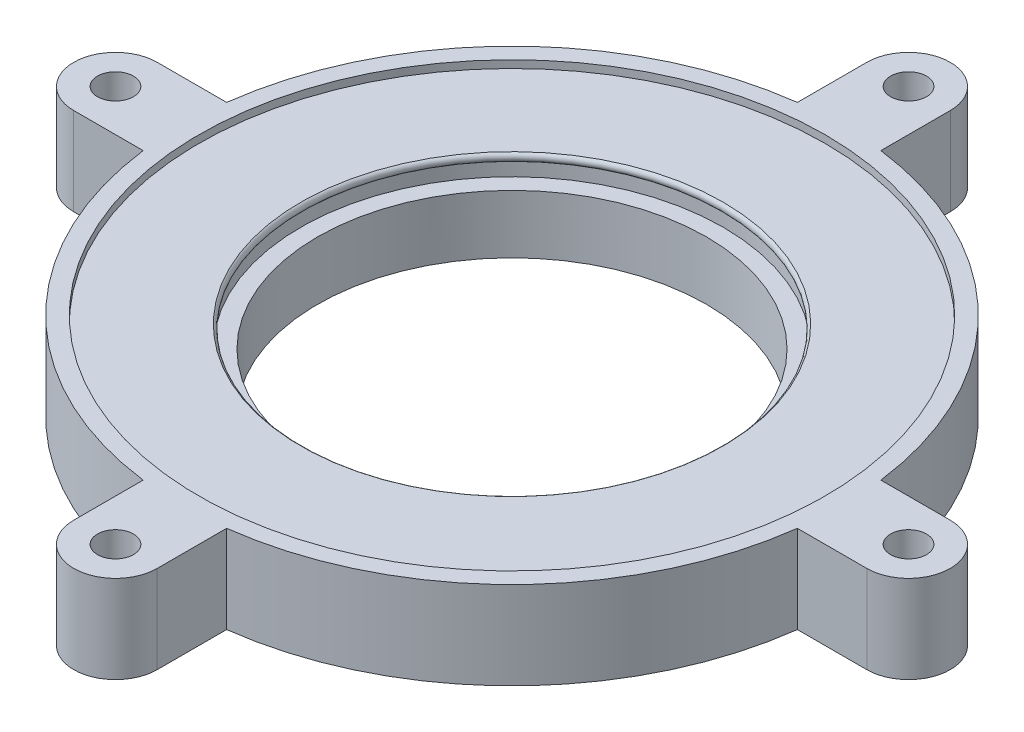
ISO-10303-21;
HEADER;
FILE_DESCRIPTION(('STEP AP214'),'2;1');
FILE_NAME('part.step','',(''),(''),'','','');
FILE_SCHEMA(('AUTOMOTIVE_DESIGN { 1 0 10303 214 1 1 1 1 }'));
ENDSEC;
DATA;
#1=APPLICATION_CONTEXT('core data for automotive mechanical design processes');
#2=APPLICATION_PROTOCOL_DEFINITION('international standard','automotive_design',2000,#1);
#3=PRODUCT_CONTEXT('',#1,'mechanical');
#4=PRODUCT('Part','Part','',(#3));
#5=PRODUCT_RELATED_PRODUCT_CATEGORY('part','',(#4));
#6=PRODUCT_DEFINITION_FORMATION('','',#4);
#7=PRODUCT_DEFINITION_CONTEXT('part definition',#1,'design');
#8=PRODUCT_DEFINITION('design','',#6,#7);
#9=PRODUCT_DEFINITION_SHAPE('','',#8);
#10=(LENGTH_UNIT() NAMED_UNIT(*) SI_UNIT(.MILLI.,.METRE.));
#11=(NAMED_UNIT(*) PLANE_ANGLE_UNIT() SI_UNIT($,.RADIAN.));
#12=(NAMED_UNIT(*) SI_UNIT($,.STERADIAN.) SOLID_ANGLE_UNIT());
#13=UNCERTAINTY_MEASURE_WITH_UNIT(LENGTH_MEASURE(1.E-05),#10,'distance_accuracy_value','');
#14=(GEOMETRIC_REPRESENTATION_CONTEXT(3) GLOBAL_UNCERTAINTY_ASSIGNED_CONTEXT((#13)) GLOBAL_UNIT_ASSIGNED_CONTEXT((#10,
#11,#12)) REPRESENTATION_CONTEXT('',''));
#15=CARTESIAN_POINT('',(0.,0.,0.));
#16=DIRECTION('',(0.,0.,1.));
#17=DIRECTION('',(1.,0.,0.));
#18=AXIS2_PLACEMENT_3D('',#15,#16,#17);
#19=CARTESIAN_POINT('',(0.,-1000.,-3.43024899888577E-12));
#20=DIRECTION('',(0.,-1.,0.));
#21=DIRECTION('',(0.,0.,-1.));
#22=AXIS2_PLACEMENT_3D('',#19,#20,#21);
#23=CYLINDRICAL_SURFACE('',#22,39.5);
#24=DIRECTION('',(0.,-1.,0.));
#25=VECTOR('',#24,1.);
#26=CARTESIAN_POINT('',(-39.1822663969283,15.605960434235,4.99999999999756));
#27=LINE('',#26,#25);
#28=CARTESIAN_POINT('',(-39.1822663969283,-1.04822907838721,5.00000000001453));
#29=VERTEX_POINT('',#28);
#30=CARTESIAN_POINT('',(-39.1822663969283,-11.5554427268863,5.00000000001478));
#31=VERTEX_POINT('',#30);
#32=EDGE_CURVE('E170',#29,#31,#27,.T.);
#33=ORIENTED_EDGE('',*,*,#32,.T.);
#34=CARTESIAN_POINT('',(0.,-11.5554427268862,0.));
#35=DIRECTION('',(0.,-1.,0.));
#36=DIRECTION('',(0.,0.,-1.));
#37=AXIS2_PLACEMENT_3D('',#34,#35,#36);
#38=CIRCLE('',#37,39.5);
#39=CARTESIAN_POINT('',(-4.99999999999997,-11.5554427268864,39.1822663969301));
#40=VERTEX_POINT('',#39);
#41=EDGE_CURVE('E316',#40,#31,#38,.T.);
#42=ORIENTED_EDGE('',*,*,#41,.F.);
#43=DIRECTION('',(0.,-1.,0.));
#44=VECTOR('',#43,1.);
#45=CARTESIAN_POINT('',(-4.99999999999997,15.6059604342349,39.1822663969302));
#46=LINE('',#45,#44);
#47=CARTESIAN_POINT('',(-4.99999999999997,-1.04822907838735,39.1822663969302));
#48=VERTEX_POINT('',#47);
#49=EDGE_CURVE('E289',#48,#40,#46,.T.);
#50=ORIENTED_EDGE('',*,*,#49,.F.);
#51=CARTESIAN_POINT('',(0.,-1.0482290783872,0.));
#52=DIRECTION('',(0.,-1.,0.));
#53=DIRECTION('',(0.,0.,-1.));
#54=AXIS2_PLACEMENT_3D('',#51,#52,#53);
#55=CIRCLE('',#54,39.5);
#56=EDGE_CURVE('E62',#48,#29,#55,.T.);
#57=ORIENTED_EDGE('',*,*,#56,.T.);
#58=EDGE_LOOP('',(#33,#42,#50,#57));
#59=FACE_BOUND('',#58,.T.);
#60=ADVANCED_FACE('F47',(#59),#23,.T.);
#61=DIRECTION('',(0.,-1.,0.));
#62=VECTOR('',#61,1.);
#63=CARTESIAN_POINT('',(-39.1822663969283,15.605960434235,-5.00000000000244));
#64=LINE('',#63,#62);
#65=CARTESIAN_POINT('',(-39.1822663969283,-1.04822907838719,-5.0000000000025));
#66=VERTEX_POINT('',#65);
#67=CARTESIAN_POINT('',(-39.1822663969298,-11.5554427268862,-5.00000000000253));
#68=VERTEX_POINT('',#67);
#69=EDGE_CURVE('E171',#66,#68,#64,.T.);
#70=ORIENTED_EDGE('',*,*,#69,.F.);
#71=CARTESIAN_POINT('',(-4.99999999999506,-1.04822907838706,-39.1822663969308));
#72=VERTEX_POINT('',#71);
#73=EDGE_CURVE('E167',#66,#72,#55,.T.);
#74=ORIENTED_EDGE('',*,*,#73,.T.);
#75=DIRECTION('',(0.,-1.,0.));
#76=VECTOR('',#75,1.);
#77=CARTESIAN_POINT('',(-4.99999999999562,15.6059604342351,-39.1822663969307));
#78=LINE('',#77,#76);
#79=CARTESIAN_POINT('',(-4.99999999999534,-11.5554427268861,-39.1822663969308));
#80=VERTEX_POINT('',#79);
#81=EDGE_CURVE('E218',#72,#80,#78,.T.);
#82=ORIENTED_EDGE('',*,*,#81,.T.);
#83=EDGE_CURVE('E70',#68,#80,#38,.T.);
#84=ORIENTED_EDGE('',*,*,#83,.F.);
#85=EDGE_LOOP('',(#70,#74,#82,#84));
#86=FACE_BOUND('',#85,.T.);
#87=ADVANCED_FACE('F340',(#86),#23,.T.);
#88=DIRECTION('',(0.,-1.,0.));
#89=VECTOR('',#88,1.);
#90=CARTESIAN_POINT('',(5.00000000000438,15.6059604342351,-39.1822663969307));
#91=LINE('',#90,#89);
#92=CARTESIAN_POINT('',(5.00000000000438,-1.04822907838706,-39.1822663969308));
#93=VERTEX_POINT('',#92);
#94=CARTESIAN_POINT('',(5.00000000000438,-11.5554427268861,-39.1822663969296));
#95=VERTEX_POINT('',#94);
#96=EDGE_CURVE('E213',#93,#95,#91,.T.);
#97=ORIENTED_EDGE('',*,*,#96,.F.);
#98=CARTESIAN_POINT('',(39.1822663969304,-1.04822907838718,-4.99999999999811));
#99=VERTEX_POINT('',#98);
#100=EDGE_CURVE('E364',#93,#99,#55,.T.);
#101=ORIENTED_EDGE('',*,*,#100,.T.);
#102=DIRECTION('',(0.,-1.,0.));
#103=VECTOR('',#102,1.);
#104=CARTESIAN_POINT('',(39.1822663969326,15.605960434235,-4.99999999999805));
#105=LINE('',#104,#103);
#106=CARTESIAN_POINT('',(39.1822663969326,-11.5554427268862,-4.9999999999806));
#107=VERTEX_POINT('',#106);
#108=EDGE_CURVE('E251',#99,#107,#105,.T.);
#109=ORIENTED_EDGE('',*,*,#108,.T.);
#110=EDGE_CURVE('E366',#95,#107,#38,.T.);
#111=ORIENTED_EDGE('',*,*,#110,.F.);
#112=EDGE_LOOP('',(#97,#101,#109,#111));
#113=FACE_BOUND('',#112,.T.);
#114=ADVANCED_FACE('F337',(#113),#23,.T.);
#115=CARTESIAN_POINT('',(0.,-2.4554427268862,0.));
#116=DIRECTION('',(0.,-1.,0.));
#117=DIRECTION('',(0.,0.,-1.));
#118=AXIS2_PLACEMENT_3D('',#115,#116,#117);
#119=TOROIDAL_SURFACE('',#118,25.5666666666667,0.566666666666666);
#120=CARTESIAN_POINT('',(0.,-2.95544272688619,0.));
#121=DIRECTION('',(0.,-1.,0.));
#122=DIRECTION('',(0.,0.,-1.));
#123=AXIS2_PLACEMENT_3D('',#120,#121,#122);
#124=CIRCLE('',#123,25.3);
#125=CARTESIAN_POINT('',(0.,-2.95544272688611,-25.3));
#126=VERTEX_POINT('',#125);
#127=EDGE_CURVE('E292',#126,#126,#124,.T.);
#128=ORIENTED_EDGE('',*,*,#127,.T.);
#129=EDGE_LOOP('',(#128));
#130=FACE_BOUND('',#129,.T.);
#131=CARTESIAN_POINT('',(0.,-1.95544272688619,0.));
#132=DIRECTION('',(0.,-1.,0.));
#133=DIRECTION('',(0.,0.,-1.));
#134=AXIS2_PLACEMENT_3D('',#131,#132,#133);
#135=CIRCLE('',#134,25.3);
#136=CARTESIAN_POINT('',(0.,-1.9554427268861,-25.3));
#137=VERTEX_POINT('',#136);
#138=EDGE_CURVE('E11',#137,#137,#135,.T.);
#139=ORIENTED_EDGE('',*,*,#138,.F.);
#140=EDGE_LOOP('',(#139));
#141=FACE_BOUND('',#140,.T.);
#142=ADVANCED_FACE('F49',(#130,#141),#119,.T.);
#143=CARTESIAN_POINT('',(0.,-1.95544272688621,0.));
#144=DIRECTION('',(0.,1.,0.));
#145=DIRECTION('',(0.,0.,1.));
#146=AXIS2_PLACEMENT_3D('',#143,#144,#145);
#147=PLANE('',#146);
#148=ORIENTED_EDGE('',*,*,#138,.T.);
#149=EDGE_LOOP('',(#148));
#150=FACE_BOUND('',#149,.T.);
#151=CARTESIAN_POINT('',(0.,-1.95544272688619,0.));
#152=DIRECTION('',(0.,-1.,0.));
#153=DIRECTION('',(0.,0.,-1.));
#154=AXIS2_PLACEMENT_3D('',#151,#152,#153);
#155=CIRCLE('',#154,37.5);
#156=CARTESIAN_POINT('',(0.,-1.95544272688606,-37.5));
#157=VERTEX_POINT('',#156);
#158=EDGE_CURVE('E55',#157,#157,#155,.T.);
#159=ORIENTED_EDGE('',*,*,#158,.F.);
#160=EDGE_LOOP('',(#159));
#161=FACE_BOUND('',#160,.T.);
#162=ADVANCED_FACE('F329',(#150,#161),#147,.T.);
#163=CARTESIAN_POINT('',(0.,-1000.,-3.43024899888577E-12));
#164=DIRECTION('',(0.,-1.,0.));
#165=DIRECTION('',(0.,0.,-1.));
#166=AXIS2_PLACEMENT_3D('',#163,#164,#165);
#167=CYLINDRICAL_SURFACE('',#166,37.5);
#168=ORIENTED_EDGE('',*,*,#158,.T.);
#169=EDGE_LOOP('',(#168));
#170=FACE_BOUND('',#169,.T.);
#171=CARTESIAN_POINT('',(0.,-1.0482290783872,0.));
#172=DIRECTION('',(0.,-1.,0.));
#173=DIRECTION('',(0.,0.,-1.));
#174=AXIS2_PLACEMENT_3D('',#171,#172,#173);
#175=CIRCLE('',#174,37.5);
#176=CARTESIAN_POINT('',(0.,-1.04822907838707,-37.5));
#177=VERTEX_POINT('',#176);
#178=EDGE_CURVE('E321',#177,#177,#175,.T.);
#179=ORIENTED_EDGE('',*,*,#178,.F.);
#180=EDGE_LOOP('',(#179));
#181=FACE_BOUND('',#180,.T.);
#182=ADVANCED_FACE('F326',(#170,#181),#167,.F.);
#183=CARTESIAN_POINT('',(0.,-1.0482290783872,0.));
#184=DIRECTION('',(0.,1.,0.));
#185=DIRECTION('',(0.,0.,1.));
#186=AXIS2_PLACEMENT_3D('',#183,#184,#185);
#187=PLANE('',#186);
#188=ORIENTED_EDGE('',*,*,#73,.F.);
#189=DIRECTION('',(1.,0.,0.));
#190=VECTOR('',#189,1.);
#191=CARTESIAN_POINT('',(-47.4999999999981,-1.04822907838719,-5.0000000000025));
#192=LINE('',#191,#190);
#193=CARTESIAN_POINT('',(-47.4999999999981,-1.04822907838719,-5.0000000000025));
#194=VERTEX_POINT('',#193);
#195=EDGE_CURVE('E160',#194,#66,#192,.T.);
#196=ORIENTED_EDGE('',*,*,#195,.F.);
#197=CARTESIAN_POINT('',(-47.4999999999981,-1.04822907838721,-2.49818003626543E-12));
#198=DIRECTION('',(0.,1.,0.));
#199=DIRECTION('',(0.,0.,1.));
#200=AXIS2_PLACEMENT_3D('',#197,#198,#199);
#201=CIRCLE('',#200,5.);
#202=CARTESIAN_POINT('',(-47.4999999999981,-1.04822907838722,4.9999999999975));
#203=VERTEX_POINT('',#202);
#204=EDGE_CURVE('E164',#203,#194,#201,.F.);
#205=ORIENTED_EDGE('',*,*,#204,.F.);
#206=DIRECTION('',(-1.,0.,0.));
#207=VECTOR('',#206,1.);
#208=CARTESIAN_POINT('',(-47.4999999999981,-1.04822907838722,4.9999999999975));
#209=LINE('',#208,#207);
#210=EDGE_CURVE('E186',#29,#203,#209,.T.);
#211=ORIENTED_EDGE('',*,*,#210,.F.);
#212=ORIENTED_EDGE('',*,*,#56,.F.);
#213=DIRECTION('',(0.,0.,-1.));
#214=VECTOR('',#213,1.);
#215=CARTESIAN_POINT('',(-5.,-1.04822907838737,47.5));
#216=LINE('',#215,#214);
#217=CARTESIAN_POINT('',(-5.,-1.04822907838737,47.5));
#218=VERTEX_POINT('',#217);
#219=EDGE_CURVE('E293',#218,#48,#216,.T.);
#220=ORIENTED_EDGE('',*,*,#219,.F.);
#221=CARTESIAN_POINT('',(0.,-1.04822907838737,47.5));
#222=DIRECTION('',(0.,1.,0.));
#223=DIRECTION('',(0.,0.,1.));
#224=AXIS2_PLACEMENT_3D('',#221,#222,#223);
#225=CIRCLE('',#224,5.);
#226=CARTESIAN_POINT('',(5.,-1.04822907838737,47.5));
#227=VERTEX_POINT('',#226);
#228=EDGE_CURVE('E260',#227,#218,#225,.F.);
#229=ORIENTED_EDGE('',*,*,#228,.F.);
#230=DIRECTION('',(0.,0.,1.));
#231=VECTOR('',#230,1.);
#232=CARTESIAN_POINT('',(5.,-1.04822907838737,47.5));
#233=LINE('',#232,#231);
#234=CARTESIAN_POINT('',(4.99999999999992,-1.04822907838733,39.1822663969301));
#235=VERTEX_POINT('',#234);
#236=EDGE_CURVE('E300',#235,#227,#233,.T.);
#237=ORIENTED_EDGE('',*,*,#236,.F.);
#238=CARTESIAN_POINT('',(39.1822663969326,-1.04822907838722,5.00000000000189));
#239=VERTEX_POINT('',#238);
#240=EDGE_CURVE('E319',#239,#235,#55,.T.);
#241=ORIENTED_EDGE('',*,*,#240,.F.);
#242=DIRECTION('',(-1.,0.,0.));
#243=VECTOR('',#242,1.);
#244=CARTESIAN_POINT('',(47.5000000000025,-1.04822907838722,5.00000000000189));
#245=LINE('',#244,#243);
#246=CARTESIAN_POINT('',(47.5000000000025,-1.04822907838722,5.00000000000189));
#247=VERTEX_POINT('',#246);
#248=EDGE_CURVE('E249',#247,#239,#245,.T.);
#249=ORIENTED_EDGE('',*,*,#248,.F.);
#250=CARTESIAN_POINT('',(47.5000000000025,-1.04822907838721,1.88842671473998E-12));
#251=DIRECTION('',(0.,1.,0.));
#252=DIRECTION('',(0.,0.,1.));
#253=AXIS2_PLACEMENT_3D('',#250,#251,#252);
#254=CIRCLE('',#253,5.);
#255=CARTESIAN_POINT('',(47.5000000000025,-1.04822907838719,-4.99999999999811));
#256=VERTEX_POINT('',#255);
#257=EDGE_CURVE('E244',#256,#247,#254,.F.);
#258=ORIENTED_EDGE('',*,*,#257,.F.);
#259=DIRECTION('',(1.,0.,0.));
#260=VECTOR('',#259,1.);
#261=CARTESIAN_POINT('',(47.5000000000025,-1.04822907838719,-4.99999999999811));
#262=LINE('',#261,#260);
#263=EDGE_CURVE('E245',#99,#256,#262,.T.);
#264=ORIENTED_EDGE('',*,*,#263,.F.);
#265=ORIENTED_EDGE('',*,*,#100,.F.);
#266=DIRECTION('',(0.,0.,1.));
#267=VECTOR('',#266,1.);
#268=CARTESIAN_POINT('',(5.00000000000438,-1.04822907838704,-47.5000000000006));
#269=LINE('',#268,#267);
#270=CARTESIAN_POINT('',(5.00000000000438,-1.04822907838704,-47.5000000000006));
#271=VERTEX_POINT('',#270);
#272=EDGE_CURVE('E216',#271,#93,#269,.T.);
#273=ORIENTED_EDGE('',*,*,#272,.F.);
#274=CARTESIAN_POINT('',(4.38078967870946E-12,-1.04822907838704,-47.5000000000006));
#275=DIRECTION('',(0.,1.,0.));
#276=DIRECTION('',(0.,0.,1.));
#277=AXIS2_PLACEMENT_3D('',#274,#275,#276);
#278=CIRCLE('',#277,5.);
#279=CARTESIAN_POINT('',(-4.99999999999562,-1.04822907838704,-47.5000000000006));
#280=VERTEX_POINT('',#279);
#281=EDGE_CURVE('E211',#280,#271,#278,.F.);
#282=ORIENTED_EDGE('',*,*,#281,.F.);
#283=DIRECTION('',(0.,0.,-1.));
#284=VECTOR('',#283,1.);
#285=CARTESIAN_POINT('',(-4.99999999999562,-1.04822907838704,-47.5000000000006));
#286=LINE('',#285,#284);
#287=EDGE_CURVE('E212',#72,#280,#286,.T.);
#288=ORIENTED_EDGE('',*,*,#287,.F.);
#289=EDGE_LOOP('',(#188,#196,#205,#211,#212,#220,#229,#237,#241,#249,#258,#264,#265,#273,#282,#288));
#290=FACE_BOUND('',#289,.T.);
#291=ORIENTED_EDGE('',*,*,#178,.T.);
#292=EDGE_LOOP('',(#291));
#293=FACE_BOUND('',#292,.T.);
#294=CARTESIAN_POINT('',(0.,-1.04822907838737,47.5));
#295=DIRECTION('',(0.,1.,0.));
#296=DIRECTION('',(0.,0.,1.));
#297=AXIS2_PLACEMENT_3D('',#294,#295,#296);
#298=CIRCLE('',#297,2.15);
#299=CARTESIAN_POINT('',(0.,-1.04822907838738,49.65));
#300=VERTEX_POINT('',#299);
#301=EDGE_CURVE('E279',#300,#300,#298,.F.);
#302=ORIENTED_EDGE('',*,*,#301,.T.);
#303=EDGE_LOOP('',(#302));
#304=FACE_BOUND('',#303,.T.);
#305=CARTESIAN_POINT('',(47.5000000000025,-1.04822907838721,1.88842671473998E-12));
#306=DIRECTION('',(0.,1.,0.));
#307=DIRECTION('',(0.,0.,1.));
#308=AXIS2_PLACEMENT_3D('',#305,#306,#307);
#309=CIRCLE('',#308,2.15000000000181);
#310=CARTESIAN_POINT('',(47.5000000000025,-1.04822907838721,2.1500000000037));
#311=VERTEX_POINT('',#310);
#312=EDGE_CURVE('E226',#311,#311,#309,.F.);
#313=ORIENTED_EDGE('',*,*,#312,.T.);
#314=EDGE_LOOP('',(#313));
#315=FACE_BOUND('',#314,.T.);
#316=CARTESIAN_POINT('',(4.38078967870946E-12,-1.04822907838704,-47.5000000000006));
#317=DIRECTION('',(0.,1.,0.));
#318=DIRECTION('',(0.,0.,1.));
#319=AXIS2_PLACEMENT_3D('',#316,#317,#318);
#320=CIRCLE('',#319,2.15000000000548);
#321=CARTESIAN_POINT('',(4.38078967870946E-12,-1.04822907838705,-45.3499999999951));
#322=VERTEX_POINT('',#321);
#323=EDGE_CURVE('E180',#322,#322,#320,.F.);
#324=ORIENTED_EDGE('',*,*,#323,.T.);
#325=EDGE_LOOP('',(#324));
#326=FACE_BOUND('',#325,.T.);
#327=CARTESIAN_POINT('',(-47.4999999999981,-1.04822907838721,-2.49818003626543E-12));
#328=DIRECTION('',(0.,1.,0.));
#329=DIRECTION('',(0.,0.,1.));
#330=AXIS2_PLACEMENT_3D('',#327,#328,#329);
#331=CIRCLE('',#330,2.15000000000515);
#332=CARTESIAN_POINT('',(-47.4999999999981,-1.04822907838721,2.15000000000265));
#333=VERTEX_POINT('',#332);
#334=EDGE_CURVE('E197',#333,#333,#331,.F.);
#335=ORIENTED_EDGE('',*,*,#334,.T.);
#336=EDGE_LOOP('',(#335));
#337=FACE_BOUND('',#336,.T.);
#338=ADVANCED_FACE('F162',(#290,#293,#304,#315,#326,#337),#187,.T.);
#339=DIRECTION('',(0.,-1.,0.));
#340=VECTOR('',#339,1.);
#341=CARTESIAN_POINT('',(39.1822663969326,15.605960434235,5.00000000000194));
#342=LINE('',#341,#340);
#343=CARTESIAN_POINT('',(39.1822663969299,-11.5554427268863,5.00000000000185));
#344=VERTEX_POINT('',#343);
#345=EDGE_CURVE('E246',#239,#344,#342,.T.);
#346=ORIENTED_EDGE('',*,*,#345,.F.);
#347=ORIENTED_EDGE('',*,*,#240,.T.);
#348=DIRECTION('',(0.,-1.,0.));
#349=VECTOR('',#348,1.);
#350=CARTESIAN_POINT('',(5.00000000000003,15.6059604342349,39.1822663969302));
#351=LINE('',#350,#349);
#352=CARTESIAN_POINT('',(5.00000000000003,-11.5554427268864,39.1822663969301));
#353=VERTEX_POINT('',#352);
#354=EDGE_CURVE('E296',#235,#353,#351,.T.);
#355=ORIENTED_EDGE('',*,*,#354,.T.);
#356=EDGE_CURVE('E315',#344,#353,#38,.T.);
#357=ORIENTED_EDGE('',*,*,#356,.F.);
#358=EDGE_LOOP('',(#346,#347,#355,#357));
#359=FACE_BOUND('',#358,.T.);
#360=ADVANCED_FACE('F342',(#359),#23,.T.);
#361=CARTESIAN_POINT('',(0.,-11.5554427268862,0.));
#362=DIRECTION('',(0.,-1.,0.));
#363=DIRECTION('',(0.,0.,-1.));
#364=AXIS2_PLACEMENT_3D('',#361,#362,#363);
#365=PLANE('',#364);
#366=CARTESIAN_POINT('',(0.,-11.5554427268862,0.));
#367=DIRECTION('',(0.,-1.,0.));
#368=DIRECTION('',(0.,0.,-1.));
#369=AXIS2_PLACEMENT_3D('',#366,#367,#368);
#370=CIRCLE('',#369,23.3);
#371=CARTESIAN_POINT('',(0.,-11.5554427268862,-23.3000000000001));
#372=VERTEX_POINT('',#371);
#373=EDGE_CURVE('E430',#372,#372,#370,.T.);
#374=ORIENTED_EDGE('',*,*,#373,.F.);
#375=EDGE_LOOP('',(#374));
#376=FACE_BOUND('',#375,.T.);
#377=CARTESIAN_POINT('',(-30.,-11.5554427268862,0.));
#378=DIRECTION('',(0.,-1.,0.));
#379=DIRECTION('',(0.,0.,-1.));
#380=AXIS2_PLACEMENT_3D('',#377,#378,#379);
#381=CIRCLE('',#380,2.15);
#382=CARTESIAN_POINT('',(-30.,-11.5554427268862,-2.15000000000004));
#383=VERTEX_POINT('',#382);
#384=EDGE_CURVE('E439',#383,#383,#381,.T.);
#385=ORIENTED_EDGE('',*,*,#384,.F.);
#386=EDGE_LOOP('',(#385));
#387=FACE_BOUND('',#386,.T.);
#388=CARTESIAN_POINT('',(0.,-11.5554427268863,30.));
#389=DIRECTION('',(0.,-1.,0.));
#390=DIRECTION('',(0.,0.,-1.));
#391=AXIS2_PLACEMENT_3D('',#388,#389,#390);
#392=CIRCLE('',#391,2.15);
#393=CARTESIAN_POINT('',(0.,-11.5554427268863,27.85));
#394=VERTEX_POINT('',#393);
#395=EDGE_CURVE('E442',#394,#394,#392,.T.);
#396=ORIENTED_EDGE('',*,*,#395,.F.);
#397=EDGE_LOOP('',(#396));
#398=FACE_BOUND('',#397,.T.);
#399=CARTESIAN_POINT('',(30.,-11.5554427268862,0.));
#400=DIRECTION('',(0.,-1.,0.));
#401=DIRECTION('',(0.,0.,-1.));
#402=AXIS2_PLACEMENT_3D('',#399,#400,#401);
#403=CIRCLE('',#402,2.15);
#404=CARTESIAN_POINT('',(30.,-11.5554427268862,-2.15000000000003));
#405=VERTEX_POINT('',#404);
#406=EDGE_CURVE('E448',#405,#405,#403,.T.);
#407=ORIENTED_EDGE('',*,*,#406,.F.);
#408=EDGE_LOOP('',(#407));
#409=FACE_BOUND('',#408,.T.);
#410=CARTESIAN_POINT('',(0.,-11.5554427268861,-30.));
#411=DIRECTION('',(0.,-1.,0.));
#412=DIRECTION('',(0.,0.,-1.));
#413=AXIS2_PLACEMENT_3D('',#410,#411,#412);
#414=CIRCLE('',#413,2.15);
#415=CARTESIAN_POINT('',(0.,-11.5554427268861,-32.15));
#416=VERTEX_POINT('',#415);
#417=EDGE_CURVE('E433',#416,#416,#414,.T.);
#418=ORIENTED_EDGE('',*,*,#417,.F.);
#419=EDGE_LOOP('',(#418));
#420=FACE_BOUND('',#419,.T.);
#421=ORIENTED_EDGE('',*,*,#41,.T.);
#422=DIRECTION('',(-1.,0.,0.));
#423=VECTOR('',#422,1.);
#424=CARTESIAN_POINT('',(-47.4999999999981,-11.5554427268863,4.99999999999747));
#425=LINE('',#424,#423);
#426=CARTESIAN_POINT('',(-47.4999999999981,-11.5554427268863,4.99999999999747));
#427=VERTEX_POINT('',#426);
#428=EDGE_CURVE('E200',#31,#427,#425,.T.);
#429=ORIENTED_EDGE('',*,*,#428,.T.);
#430=CARTESIAN_POINT('',(-47.4999999999981,-11.5554427268862,-2.53422239536427E-12));
#431=DIRECTION('',(0.,-1.,0.));
#432=DIRECTION('',(0.,0.,-1.));
#433=AXIS2_PLACEMENT_3D('',#430,#431,#432);
#434=CIRCLE('',#433,5.);
#435=CARTESIAN_POINT('',(-47.4999999999981,-11.5554427268862,-5.00000000000253));
#436=VERTEX_POINT('',#435);
#437=EDGE_CURVE('E204',#427,#436,#434,.T.);
#438=ORIENTED_EDGE('',*,*,#437,.T.);
#439=DIRECTION('',(1.,0.,0.));
#440=VECTOR('',#439,1.);
#441=CARTESIAN_POINT('',(-47.4999999999981,-11.5554427268862,-5.00000000000253));
#442=LINE('',#441,#440);
#443=EDGE_CURVE('E184',#436,#68,#442,.T.);
#444=ORIENTED_EDGE('',*,*,#443,.T.);
#445=ORIENTED_EDGE('',*,*,#83,.T.);
#446=DIRECTION('',(0.,0.,-1.));
#447=VECTOR('',#446,1.);
#448=CARTESIAN_POINT('',(-4.99999999999562,-11.5554427268861,-47.5000000000006));
#449=LINE('',#448,#447);
#450=CARTESIAN_POINT('',(-4.99999999999562,-11.5554427268861,-47.5000000000006));
#451=VERTEX_POINT('',#450);
#452=EDGE_CURVE('E231',#80,#451,#449,.T.);
#453=ORIENTED_EDGE('',*,*,#452,.T.);
#454=CARTESIAN_POINT('',(4.38078967870946E-12,-11.5554427268861,-47.5000000000006));
#455=DIRECTION('',(0.,-1.,0.));
#456=DIRECTION('',(0.,0.,-1.));
#457=AXIS2_PLACEMENT_3D('',#454,#455,#456);
#458=CIRCLE('',#457,5.);
#459=CARTESIAN_POINT('',(5.00000000000438,-11.5554427268861,-47.5000000000006));
#460=VERTEX_POINT('',#459);
#461=EDGE_CURVE('E234',#451,#460,#458,.T.);
#462=ORIENTED_EDGE('',*,*,#461,.T.);
#463=DIRECTION('',(0.,0.,1.));
#464=VECTOR('',#463,1.);
#465=CARTESIAN_POINT('',(5.00000000000438,-11.5554427268861,-47.5000000000006));
#466=LINE('',#465,#464);
#467=EDGE_CURVE('E237',#460,#95,#466,.T.);
#468=ORIENTED_EDGE('',*,*,#467,.T.);
#469=ORIENTED_EDGE('',*,*,#110,.T.);
#470=DIRECTION('',(1.,0.,0.));
#471=VECTOR('',#470,1.);
#472=CARTESIAN_POINT('',(47.5000000000025,-11.5554427268862,-4.99999999999815));
#473=LINE('',#472,#471);
#474=CARTESIAN_POINT('',(47.5000000000025,-11.5554427268862,-4.99999999999815));
#475=VERTEX_POINT('',#474);
#476=EDGE_CURVE('E265',#107,#475,#473,.T.);
#477=ORIENTED_EDGE('',*,*,#476,.T.);
#478=CARTESIAN_POINT('',(47.5000000000025,-11.5554427268862,1.85238435564114E-12));
#479=DIRECTION('',(0.,-1.,0.));
#480=DIRECTION('',(0.,0.,-1.));
#481=AXIS2_PLACEMENT_3D('',#478,#479,#480);
#482=CIRCLE('',#481,5.);
#483=CARTESIAN_POINT('',(47.5000000000025,-11.5554427268863,5.00000000000185));
#484=VERTEX_POINT('',#483);
#485=EDGE_CURVE('E268',#475,#484,#482,.T.);
#486=ORIENTED_EDGE('',*,*,#485,.T.);
#487=DIRECTION('',(-1.,0.,0.));
#488=VECTOR('',#487,1.);
#489=CARTESIAN_POINT('',(47.5000000000025,-11.5554427268863,5.00000000000185));
#490=LINE('',#489,#488);
#491=EDGE_CURVE('E271',#484,#344,#490,.T.);
#492=ORIENTED_EDGE('',*,*,#491,.T.);
#493=ORIENTED_EDGE('',*,*,#356,.T.);
#494=DIRECTION('',(0.,0.,1.));
#495=VECTOR('',#494,1.);
#496=CARTESIAN_POINT('',(5.,-11.5554427268864,47.5));
#497=LINE('',#496,#495);
#498=CARTESIAN_POINT('',(5.,-11.5554427268864,47.5));
#499=VERTEX_POINT('',#498);
#500=EDGE_CURVE('E276',#353,#499,#497,.T.);
#501=ORIENTED_EDGE('',*,*,#500,.T.);
#502=CARTESIAN_POINT('',(0.,-11.5554427268864,47.5));
#503=DIRECTION('',(0.,-1.,0.));
#504=DIRECTION('',(0.,0.,-1.));
#505=AXIS2_PLACEMENT_3D('',#502,#503,#504);
#506=CIRCLE('',#505,5.);
#507=CARTESIAN_POINT('',(-5.,-11.5554427268864,47.5));
#508=VERTEX_POINT('',#507);
#509=EDGE_CURVE('E283',#499,#508,#506,.T.);
#510=ORIENTED_EDGE('',*,*,#509,.T.);
#511=DIRECTION('',(0.,0.,-1.));
#512=VECTOR('',#511,1.);
#513=CARTESIAN_POINT('',(-5.,-11.5554427268864,47.5));
#514=LINE('',#513,#512);
#515=EDGE_CURVE('E280',#508,#40,#514,.T.);
#516=ORIENTED_EDGE('',*,*,#515,.T.);
#517=EDGE_LOOP('',(#421,#429,#438,#444,#445,#453,#462,#468,#469,#477,#486,#492,#493,#501,#510,#516));
#518=FACE_BOUND('',#517,.T.);
#519=CARTESIAN_POINT('',(0.,-11.5554427268864,47.5));
#520=DIRECTION('',(0.,-1.,0.));
#521=DIRECTION('',(0.,0.,-1.));
#522=AXIS2_PLACEMENT_3D('',#519,#520,#521);
#523=CIRCLE('',#522,2.15);
#524=CARTESIAN_POINT('',(0.,-11.5554427268864,45.35));
#525=VERTEX_POINT('',#524);
#526=EDGE_CURVE('E286',#525,#525,#523,.T.);
#527=ORIENTED_EDGE('',*,*,#526,.F.);
#528=EDGE_LOOP('',(#527));
#529=FACE_BOUND('',#528,.T.);
#530=CARTESIAN_POINT('',(47.5000000000025,-11.5554427268862,1.85238435564113E-12));
#531=DIRECTION('',(0.,-1.,0.));
#532=DIRECTION('',(0.,0.,-1.));
#533=AXIS2_PLACEMENT_3D('',#530,#531,#532);
#534=CIRCLE('',#533,2.15000000000181);
#535=CARTESIAN_POINT('',(47.5000000000025,-11.5554427268862,-2.14999999999996));
#536=VERTEX_POINT('',#535);
#537=EDGE_CURVE('E250',#536,#536,#534,.T.);
#538=ORIENTED_EDGE('',*,*,#537,.F.);
#539=EDGE_LOOP('',(#538));
#540=FACE_BOUND('',#539,.T.);
#541=CARTESIAN_POINT('',(4.38078967870946E-12,-11.5554427268861,-47.5000000000006));
#542=DIRECTION('',(0.,-1.,0.));
#543=DIRECTION('',(0.,0.,-1.));
#544=AXIS2_PLACEMENT_3D('',#541,#542,#543);
#545=CIRCLE('',#544,2.15000000000548);
#546=CARTESIAN_POINT('',(4.38078967870946E-12,-11.5554427268861,-49.6500000000061));
#547=VERTEX_POINT('',#546);
#548=EDGE_CURVE('E217',#547,#547,#545,.T.);
#549=ORIENTED_EDGE('',*,*,#548,.F.);
#550=EDGE_LOOP('',(#549));
#551=FACE_BOUND('',#550,.T.);
#552=CARTESIAN_POINT('',(-47.4999999999981,-11.5554427268862,-2.53422239536427E-12));
#553=DIRECTION('',(0.,-1.,0.));
#554=DIRECTION('',(0.,0.,-1.));
#555=AXIS2_PLACEMENT_3D('',#552,#553,#554);
#556=CIRCLE('',#555,2.15000000000515);
#557=CARTESIAN_POINT('',(-47.4999999999981,-11.5554427268862,-2.15000000000768));
#558=VERTEX_POINT('',#557);
#559=EDGE_CURVE('E194',#558,#558,#556,.T.);
#560=ORIENTED_EDGE('',*,*,#559,.F.);
#561=EDGE_LOOP('',(#560));
#562=FACE_BOUND('',#561,.T.);
#563=ADVANCED_FACE('F349',(#376,#387,#398,#409,#420,#518,#529,#540,#551,#562),#365,.T.);
#564=CARTESIAN_POINT('',(0.,-4.55544272688626,0.));
#565=DIRECTION('',(0.,1.,0.));
#566=DIRECTION('',(0.,0.,1.));
#567=AXIS2_PLACEMENT_3D('',#564,#565,#566);
#568=PLANE('',#567);
#569=CARTESIAN_POINT('',(0.,-4.55544272688625,0.));
#570=DIRECTION('',(0.,1.,0.));
#571=DIRECTION('',(0.,0.,1.));
#572=AXIS2_PLACEMENT_3D('',#569,#570,#571);
#573=CIRCLE('',#572,23.3);
#574=CARTESIAN_POINT('',(0.,-4.55544272688633,23.3));
#575=VERTEX_POINT('',#574);
#576=EDGE_CURVE('E423',#575,#575,#573,.F.);
#577=ORIENTED_EDGE('',*,*,#576,.T.);
#578=EDGE_LOOP('',(#577));
#579=FACE_BOUND('',#578,.T.);
#580=CARTESIAN_POINT('',(0.,-4.55544272688624,0.));
#581=DIRECTION('',(0.,-1.,0.));
#582=DIRECTION('',(0.,0.,-1.));
#583=AXIS2_PLACEMENT_3D('',#580,#581,#582);
#584=CIRCLE('',#583,25.3);
#585=CARTESIAN_POINT('',(0.,-4.55544272688615,-25.3));
#586=VERTEX_POINT('',#585);
#587=EDGE_CURVE('E312',#586,#586,#584,.T.);
#588=ORIENTED_EDGE('',*,*,#587,.F.);
#589=EDGE_LOOP('',(#588));
#590=FACE_BOUND('',#589,.T.);
#591=ADVANCED_FACE('F356',(#579,#590),#568,.T.);
#592=CARTESIAN_POINT('',(0.,-1000.,-3.43024899888577E-12));
#593=DIRECTION('',(0.,-1.,0.));
#594=DIRECTION('',(0.,0.,-1.));
#595=AXIS2_PLACEMENT_3D('',#592,#593,#594);
#596=CYLINDRICAL_SURFACE('',#595,25.3);
#597=ORIENTED_EDGE('',*,*,#587,.T.);
#598=EDGE_LOOP('',(#597));
#599=FACE_BOUND('',#598,.T.);
#600=ORIENTED_EDGE('',*,*,#127,.F.);
#601=EDGE_LOOP('',(#600));
#602=FACE_BOUND('',#601,.T.);
#603=ADVANCED_FACE('F400',(#599,#602),#596,.F.);
#604=CARTESIAN_POINT('',(0.,15.6059604342349,47.5));
#605=DIRECTION('',(0.,-1.,0.));
#606=DIRECTION('',(0.,0.,-1.));
#607=AXIS2_PLACEMENT_3D('',#604,#605,#606);
#608=CYLINDRICAL_SURFACE('',#607,5.);
#609=DIRECTION('',(0.,-1.,0.));
#610=VECTOR('',#609,1.);
#611=CARTESIAN_POINT('',(5.,15.6059604342349,47.5));
#612=LINE('',#611,#610);
#613=EDGE_CURVE('E303',#227,#499,#612,.T.);
#614=ORIENTED_EDGE('',*,*,#613,.F.);
#615=ORIENTED_EDGE('',*,*,#228,.T.);
#616=DIRECTION('',(0.,-1.,0.));
#617=VECTOR('',#616,1.);
#618=CARTESIAN_POINT('',(-5.,15.6059604342349,47.5));
#619=LINE('',#618,#617);
#620=EDGE_CURVE('E299',#218,#508,#619,.T.);
#621=ORIENTED_EDGE('',*,*,#620,.T.);
#622=ORIENTED_EDGE('',*,*,#509,.F.);
#623=EDGE_LOOP('',(#614,#615,#621,#622));
#624=FACE_BOUND('',#623,.T.);
#625=ADVANCED_FACE('F398',(#624),#608,.T.);
#626=CARTESIAN_POINT('',(5.,15.6059604342349,47.5));
#627=DIRECTION('',(1.,0.,0.));
#628=DIRECTION('',(0.,0.,-1.));
#629=AXIS2_PLACEMENT_3D('',#626,#627,#628);
#630=PLANE('',#629);
#631=ORIENTED_EDGE('',*,*,#354,.F.);
#632=ORIENTED_EDGE('',*,*,#236,.T.);
#633=ORIENTED_EDGE('',*,*,#613,.T.);
#634=ORIENTED_EDGE('',*,*,#500,.F.);
#635=EDGE_LOOP('',(#631,#632,#633,#634));
#636=FACE_BOUND('',#635,.T.);
#637=ADVANCED_FACE('F384',(#636),#630,.T.);
#638=CARTESIAN_POINT('',(-5.,15.6059604342349,47.5));
#639=DIRECTION('',(-1.,0.,0.));
#640=DIRECTION('',(0.,0.,1.));
#641=AXIS2_PLACEMENT_3D('',#638,#639,#640);
#642=PLANE('',#641);
#643=ORIENTED_EDGE('',*,*,#620,.F.);
#644=ORIENTED_EDGE('',*,*,#219,.T.);
#645=ORIENTED_EDGE('',*,*,#49,.T.);
#646=ORIENTED_EDGE('',*,*,#515,.F.);
#647=EDGE_LOOP('',(#643,#644,#645,#646));
#648=FACE_BOUND('',#647,.T.);
#649=ADVANCED_FACE('F396',(#648),#642,.T.);
#650=CARTESIAN_POINT('',(0.,15.6059604342349,47.5));
#651=DIRECTION('',(0.,-1.,0.));
#652=DIRECTION('',(0.,0.,-1.));
#653=AXIS2_PLACEMENT_3D('',#650,#651,#652);
#654=CYLINDRICAL_SURFACE('',#653,2.15);
#655=ORIENTED_EDGE('',*,*,#526,.T.);
#656=EDGE_LOOP('',(#655));
#657=FACE_BOUND('',#656,.T.);
#658=ORIENTED_EDGE('',*,*,#301,.F.);
#659=EDGE_LOOP('',(#658));
#660=FACE_BOUND('',#659,.T.);
#661=ADVANCED_FACE('F410',(#657,#660),#654,.F.);
#662=CARTESIAN_POINT('',(47.5000000000025,15.605960434235,1.9455547316429E-12));
#663=DIRECTION('',(0.,-1.,0.));
#664=DIRECTION('',(0.,0.,-1.));
#665=AXIS2_PLACEMENT_3D('',#662,#663,#664);
#666=CYLINDRICAL_SURFACE('',#665,5.);
#667=DIRECTION('',(0.,-1.,0.));
#668=VECTOR('',#667,1.);
#669=CARTESIAN_POINT('',(47.5000000000025,15.605960434235,-4.99999999999806));
#670=LINE('',#669,#668);
#671=EDGE_CURVE('E254',#256,#475,#670,.T.);
#672=ORIENTED_EDGE('',*,*,#671,.F.);
#673=ORIENTED_EDGE('',*,*,#257,.T.);
#674=DIRECTION('',(0.,-1.,0.));
#675=VECTOR('',#674,1.);
#676=CARTESIAN_POINT('',(47.5000000000025,15.605960434235,5.00000000000195));
#677=LINE('',#676,#675);
#678=EDGE_CURVE('E242',#247,#484,#677,.T.);
#679=ORIENTED_EDGE('',*,*,#678,.T.);
#680=ORIENTED_EDGE('',*,*,#485,.F.);
#681=EDGE_LOOP('',(#672,#673,#679,#680));
#682=FACE_BOUND('',#681,.T.);
#683=ADVANCED_FACE('F412',(#682),#666,.T.);
#684=CARTESIAN_POINT('',(47.5000000000025,15.605960434235,-4.99999999999806));
#685=DIRECTION('',(0.,0.,-1.));
#686=DIRECTION('',(0.,1.,0.));
#687=AXIS2_PLACEMENT_3D('',#684,#685,#686);
#688=PLANE('',#687);
#689=ORIENTED_EDGE('',*,*,#108,.F.);
#690=ORIENTED_EDGE('',*,*,#263,.T.);
#691=ORIENTED_EDGE('',*,*,#671,.T.);
#692=ORIENTED_EDGE('',*,*,#476,.F.);
#693=EDGE_LOOP('',(#689,#690,#691,#692));
#694=FACE_BOUND('',#693,.T.);
#695=ADVANCED_FACE('F499',(#694),#688,.T.);
#696=CARTESIAN_POINT('',(47.5000000000025,15.605960434235,5.00000000000195));
#697=DIRECTION('',(0.,0.,1.));
#698=DIRECTION('',(0.,-1.,0.));
#699=AXIS2_PLACEMENT_3D('',#696,#697,#698);
#700=PLANE('',#699);
#701=ORIENTED_EDGE('',*,*,#678,.F.);
#702=ORIENTED_EDGE('',*,*,#248,.T.);
#703=ORIENTED_EDGE('',*,*,#345,.T.);
#704=ORIENTED_EDGE('',*,*,#491,.F.);
#705=EDGE_LOOP('',(#701,#702,#703,#704));
#706=FACE_BOUND('',#705,.T.);
#707=ADVANCED_FACE('F495',(#706),#700,.T.);
#708=CARTESIAN_POINT('',(47.5000000000025,15.605960434235,1.9455547316429E-12));
#709=DIRECTION('',(0.,-1.,0.));
#710=DIRECTION('',(0.,0.,-1.));
#711=AXIS2_PLACEMENT_3D('',#708,#709,#710);
#712=CYLINDRICAL_SURFACE('',#711,2.15000000000181);
#713=ORIENTED_EDGE('',*,*,#537,.T.);
#714=EDGE_LOOP('',(#713));
#715=FACE_BOUND('',#714,.T.);
#716=ORIENTED_EDGE('',*,*,#312,.F.);
#717=EDGE_LOOP('',(#716));
#718=FACE_BOUND('',#717,.T.);
#719=ADVANCED_FACE('F488',(#715,#718),#712,.F.);
#720=CARTESIAN_POINT('',(4.38078967870946E-12,15.6059604342352,-47.5000000000005));
#721=DIRECTION('',(0.,-1.,0.));
#722=DIRECTION('',(0.,0.,-1.));
#723=AXIS2_PLACEMENT_3D('',#720,#721,#722);
#724=CYLINDRICAL_SURFACE('',#723,5.);
#725=DIRECTION('',(0.,-1.,0.));
#726=VECTOR('',#725,1.);
#727=CARTESIAN_POINT('',(-4.99999999999562,15.6059604342352,-47.5000000000005));
#728=LINE('',#727,#726);
#729=EDGE_CURVE('E220',#280,#451,#728,.T.);
#730=ORIENTED_EDGE('',*,*,#729,.F.);
#731=ORIENTED_EDGE('',*,*,#281,.T.);
#732=DIRECTION('',(0.,-1.,0.));
#733=VECTOR('',#732,1.);
#734=CARTESIAN_POINT('',(5.00000000000438,15.6059604342352,-47.5000000000005));
#735=LINE('',#734,#733);
#736=EDGE_CURVE('E209',#271,#460,#735,.T.);
#737=ORIENTED_EDGE('',*,*,#736,.T.);
#738=ORIENTED_EDGE('',*,*,#461,.F.);
#739=EDGE_LOOP('',(#730,#731,#737,#738));
#740=FACE_BOUND('',#739,.T.);
#741=ADVANCED_FACE('F373',(#740),#724,.T.);
#742=CARTESIAN_POINT('',(-4.99999999999562,15.6059604342352,-47.5000000000005));
#743=DIRECTION('',(-1.,0.,0.));
#744=DIRECTION('',(0.,0.,1.));
#745=AXIS2_PLACEMENT_3D('',#742,#743,#744);
#746=PLANE('',#745);
#747=ORIENTED_EDGE('',*,*,#81,.F.);
#748=ORIENTED_EDGE('',*,*,#287,.T.);
#749=ORIENTED_EDGE('',*,*,#729,.T.);
#750=ORIENTED_EDGE('',*,*,#452,.F.);
#751=EDGE_LOOP('',(#747,#748,#749,#750));
#752=FACE_BOUND('',#751,.T.);
#753=ADVANCED_FACE('F378',(#752),#746,.T.);
#754=CARTESIAN_POINT('',(5.00000000000438,15.6059604342352,-47.5000000000005));
#755=DIRECTION('',(1.,0.,0.));
#756=DIRECTION('',(0.,0.,-1.));
#757=AXIS2_PLACEMENT_3D('',#754,#755,#756);
#758=PLANE('',#757);
#759=ORIENTED_EDGE('',*,*,#736,.F.);
#760=ORIENTED_EDGE('',*,*,#272,.T.);
#761=ORIENTED_EDGE('',*,*,#96,.T.);
#762=ORIENTED_EDGE('',*,*,#467,.F.);
#763=EDGE_LOOP('',(#759,#760,#761,#762));
#764=FACE_BOUND('',#763,.T.);
#765=ADVANCED_FACE('F370',(#764),#758,.T.);
#766=CARTESIAN_POINT('',(4.38078967870946E-12,15.6059604342352,-47.5000000000005));
#767=DIRECTION('',(0.,-1.,0.));
#768=DIRECTION('',(0.,0.,-1.));
#769=AXIS2_PLACEMENT_3D('',#766,#767,#768);
#770=CYLINDRICAL_SURFACE('',#769,2.15000000000548);
#771=ORIENTED_EDGE('',*,*,#548,.T.);
#772=EDGE_LOOP('',(#771));
#773=FACE_BOUND('',#772,.T.);
#774=ORIENTED_EDGE('',*,*,#323,.F.);
#775=EDGE_LOOP('',(#774));
#776=FACE_BOUND('',#775,.T.);
#777=ADVANCED_FACE('F478',(#773,#776),#770,.F.);
#778=CARTESIAN_POINT('',(-47.4999999999981,15.605960434235,-2.4410520193625E-12));
#779=DIRECTION('',(0.,-1.,0.));
#780=DIRECTION('',(0.,0.,-1.));
#781=AXIS2_PLACEMENT_3D('',#778,#779,#780);
#782=CYLINDRICAL_SURFACE('',#781,5.);
#783=DIRECTION('',(0.,-1.,0.));
#784=VECTOR('',#783,1.);
#785=CARTESIAN_POINT('',(-47.4999999999981,15.605960434235,4.99999999999756));
#786=LINE('',#785,#784);
#787=EDGE_CURVE('E178',#203,#427,#786,.T.);
#788=ORIENTED_EDGE('',*,*,#787,.F.);
#789=ORIENTED_EDGE('',*,*,#204,.T.);
#790=DIRECTION('',(0.,-1.,0.));
#791=VECTOR('',#790,1.);
#792=CARTESIAN_POINT('',(-47.4999999999981,15.605960434235,-5.00000000000244));
#793=LINE('',#792,#791);
#794=EDGE_CURVE('E176',#194,#436,#793,.T.);
#795=ORIENTED_EDGE('',*,*,#794,.T.);
#796=ORIENTED_EDGE('',*,*,#437,.F.);
#797=EDGE_LOOP('',(#788,#789,#795,#796));
#798=FACE_BOUND('',#797,.T.);
#799=ADVANCED_FACE('F174',(#798),#782,.T.);
#800=CARTESIAN_POINT('',(-47.4999999999981,15.605960434235,4.99999999999756));
#801=DIRECTION('',(0.,0.,1.));
#802=DIRECTION('',(0.,-1.,0.));
#803=AXIS2_PLACEMENT_3D('',#800,#801,#802);
#804=PLANE('',#803);
#805=ORIENTED_EDGE('',*,*,#32,.F.);
#806=ORIENTED_EDGE('',*,*,#210,.T.);
#807=ORIENTED_EDGE('',*,*,#787,.T.);
#808=ORIENTED_EDGE('',*,*,#428,.F.);
#809=EDGE_LOOP('',(#805,#806,#807,#808));
#810=FACE_BOUND('',#809,.T.);
#811=ADVANCED_FACE('F392',(#810),#804,.T.);
#812=CARTESIAN_POINT('',(-47.4999999999981,15.605960434235,-5.00000000000244));
#813=DIRECTION('',(0.,0.,-1.));
#814=DIRECTION('',(0.,1.,0.));
#815=AXIS2_PLACEMENT_3D('',#812,#813,#814);
#816=PLANE('',#815);
#817=ORIENTED_EDGE('',*,*,#794,.F.);
#818=ORIENTED_EDGE('',*,*,#195,.T.);
#819=ORIENTED_EDGE('',*,*,#69,.T.);
#820=ORIENTED_EDGE('',*,*,#443,.F.);
#821=EDGE_LOOP('',(#817,#818,#819,#820));
#822=FACE_BOUND('',#821,.T.);
#823=ADVANCED_FACE('F182',(#822),#816,.T.);
#824=CARTESIAN_POINT('',(-47.4999999999981,15.605960434235,-2.4410520193625E-12));
#825=DIRECTION('',(0.,-1.,0.));
#826=DIRECTION('',(0.,0.,-1.));
#827=AXIS2_PLACEMENT_3D('',#824,#825,#826);
#828=CYLINDRICAL_SURFACE('',#827,2.15000000000515);
#829=ORIENTED_EDGE('',*,*,#559,.T.);
#830=EDGE_LOOP('',(#829));
#831=FACE_BOUND('',#830,.T.);
#832=ORIENTED_EDGE('',*,*,#334,.F.);
#833=EDGE_LOOP('',(#832));
#834=FACE_BOUND('',#833,.T.);
#835=ADVANCED_FACE('F459',(#831,#834),#828,.F.);
#836=CARTESIAN_POINT('',(0.,-4.55544272688613,-30.));
#837=DIRECTION('',(0.,-1.,0.));
#838=DIRECTION('',(0.,0.,-1.));
#839=AXIS2_PLACEMENT_3D('',#836,#837,#838);
#840=CYLINDRICAL_SURFACE('',#839,2.15);
#841=CARTESIAN_POINT('',(0.,-4.55544272688613,-30.));
#842=DIRECTION('',(0.,-1.,0.));
#843=DIRECTION('',(0.,0.,-1.));
#844=AXIS2_PLACEMENT_3D('',#841,#842,#843);
#845=CIRCLE('',#844,2.15);
#846=CARTESIAN_POINT('',(0.,-4.55544272688613,-32.15));
#847=VERTEX_POINT('',#846);
#848=EDGE_CURVE('E191',#847,#847,#845,.T.);
#849=ORIENTED_EDGE('',*,*,#848,.F.);
#850=EDGE_LOOP('',(#849));
#851=FACE_BOUND('',#850,.T.);
#852=ORIENTED_EDGE('',*,*,#417,.T.);
#853=EDGE_LOOP('',(#852));
#854=FACE_BOUND('',#853,.T.);
#855=ADVANCED_FACE('F456',(#851,#854),#840,.F.);
#856=CARTESIAN_POINT('',(0.,-4.55544272688613,-30.));
#857=DIRECTION('',(0.,-1.,0.));
#858=DIRECTION('',(0.,0.,-1.));
#859=AXIS2_PLACEMENT_3D('',#856,#857,#858);
#860=PLANE('',#859);
#861=ORIENTED_EDGE('',*,*,#848,.T.);
#862=EDGE_LOOP('',(#861));
#863=FACE_BOUND('',#862,.T.);
#864=ADVANCED_FACE('F458',(#863),#860,.T.);
#865=CARTESIAN_POINT('',(30.,-4.55544272688624,0.));
#866=DIRECTION('',(0.,-1.,0.));
#867=DIRECTION('',(0.,0.,-1.));
#868=AXIS2_PLACEMENT_3D('',#865,#866,#867);
#869=CYLINDRICAL_SURFACE('',#868,2.15);
#870=CARTESIAN_POINT('',(30.,-4.55544272688624,0.));
#871=DIRECTION('',(0.,-1.,0.));
#872=DIRECTION('',(0.,0.,-1.));
#873=AXIS2_PLACEMENT_3D('',#870,#871,#872);
#874=CIRCLE('',#873,2.15);
#875=CARTESIAN_POINT('',(30.,-4.55544272688623,-2.15000000000001));
#876=VERTEX_POINT('',#875);
#877=EDGE_CURVE('E451',#876,#876,#874,.T.);
#878=ORIENTED_EDGE('',*,*,#877,.F.);
#879=EDGE_LOOP('',(#878));
#880=FACE_BOUND('',#879,.T.);
#881=ORIENTED_EDGE('',*,*,#406,.T.);
#882=EDGE_LOOP('',(#881));
#883=FACE_BOUND('',#882,.T.);
#884=ADVANCED_FACE('F465',(#880,#883),#869,.F.);
#885=CARTESIAN_POINT('',(30.,-4.55544272688624,0.));
#886=DIRECTION('',(0.,-1.,0.));
#887=DIRECTION('',(0.,0.,-1.));
#888=AXIS2_PLACEMENT_3D('',#885,#886,#887);
#889=PLANE('',#888);
#890=ORIENTED_EDGE('',*,*,#877,.T.);
#891=EDGE_LOOP('',(#890));
#892=FACE_BOUND('',#891,.T.);
#893=ADVANCED_FACE('F473',(#892),#889,.T.);
#894=CARTESIAN_POINT('',(0.,-4.55544272688634,30.));
#895=DIRECTION('',(0.,-1.,0.));
#896=DIRECTION('',(0.,0.,-1.));
#897=AXIS2_PLACEMENT_3D('',#894,#895,#896);
#898=CYLINDRICAL_SURFACE('',#897,2.15);
#899=CARTESIAN_POINT('',(0.,-4.55544272688634,30.));
#900=DIRECTION('',(0.,-1.,0.));
#901=DIRECTION('',(0.,0.,-1.));
#902=AXIS2_PLACEMENT_3D('',#899,#900,#901);
#903=CIRCLE('',#902,2.15);
#904=CARTESIAN_POINT('',(0.,-4.55544272688633,27.85));
#905=VERTEX_POINT('',#904);
#906=EDGE_CURVE('E445',#905,#905,#903,.T.);
#907=ORIENTED_EDGE('',*,*,#906,.F.);
#908=EDGE_LOOP('',(#907));
#909=FACE_BOUND('',#908,.T.);
#910=ORIENTED_EDGE('',*,*,#395,.T.);
#911=EDGE_LOOP('',(#910));
#912=FACE_BOUND('',#911,.T.);
#913=ADVANCED_FACE('F608',(#909,#912),#898,.F.);
#914=CARTESIAN_POINT('',(0.,-4.55544272688634,30.));
#915=DIRECTION('',(0.,-1.,0.));
#916=DIRECTION('',(0.,0.,-1.));
#917=AXIS2_PLACEMENT_3D('',#914,#915,#916);
#918=PLANE('',#917);
#919=ORIENTED_EDGE('',*,*,#906,.T.);
#920=EDGE_LOOP('',(#919));
#921=FACE_BOUND('',#920,.T.);
#922=ADVANCED_FACE('F600',(#921),#918,.T.);
#923=CARTESIAN_POINT('',(-30.,-4.55544272688624,0.));
#924=DIRECTION('',(0.,-1.,0.));
#925=DIRECTION('',(0.,0.,-1.));
#926=AXIS2_PLACEMENT_3D('',#923,#924,#925);
#927=CYLINDRICAL_SURFACE('',#926,2.15);
#928=CARTESIAN_POINT('',(-30.,-4.55544272688624,0.));
#929=DIRECTION('',(0.,-1.,0.));
#930=DIRECTION('',(0.,0.,-1.));
#931=AXIS2_PLACEMENT_3D('',#928,#929,#930);
#932=CIRCLE('',#931,2.15);
#933=CARTESIAN_POINT('',(-30.,-4.55544272688623,-2.15000000000002));
#934=VERTEX_POINT('',#933);
#935=EDGE_CURVE('E201',#934,#934,#932,.T.);
#936=ORIENTED_EDGE('',*,*,#935,.F.);
#937=EDGE_LOOP('',(#936));
#938=FACE_BOUND('',#937,.T.);
#939=ORIENTED_EDGE('',*,*,#384,.T.);
#940=EDGE_LOOP('',(#939));
#941=FACE_BOUND('',#940,.T.);
#942=ADVANCED_FACE('F595',(#938,#941),#927,.F.);
#943=CARTESIAN_POINT('',(-30.,-4.55544272688624,0.));
#944=DIRECTION('',(0.,-1.,0.));
#945=DIRECTION('',(0.,0.,-1.));
#946=AXIS2_PLACEMENT_3D('',#943,#944,#945);
#947=PLANE('',#946);
#948=ORIENTED_EDGE('',*,*,#935,.T.);
#949=EDGE_LOOP('',(#948));
#950=FACE_BOUND('',#949,.T.);
#951=ADVANCED_FACE('F575',(#950),#947,.T.);
#952=CARTESIAN_POINT('',(0.,64.1753364044461,2.20137383454509E-13));
#953=DIRECTION('',(0.,-1.,0.));
#954=DIRECTION('',(0.,0.,-1.));
#955=AXIS2_PLACEMENT_3D('',#952,#953,#954);
#956=CYLINDRICAL_SURFACE('',#955,23.3);
#957=ORIENTED_EDGE('',*,*,#576,.F.);
#958=EDGE_LOOP('',(#957));
#959=FACE_BOUND('',#958,.T.);
#960=ORIENTED_EDGE('',*,*,#373,.T.);
#961=EDGE_LOOP('',(#960));
#962=FACE_BOUND('',#961,.T.);
#963=ADVANCED_FACE('F585',(#959,#962),#956,.F.);
#964=CLOSED_SHELL('',(#60,#87,#114,#142,#162,#182,#338,#360,#563,#591,#603,#625,#637,#649,#661,
#683,#695,#707,#719,#741,#753,#765,#777,#799,#811,#823,#835,#855,#864,#884,#893,#913,#922,#942,
#951,#963));
#965=MANIFOLD_SOLID_BREP('B2',#964);
#966=ADVANCED_BREP_SHAPE_REPRESENTATION('',(#18,#965),#14);
#967=SHAPE_DEFINITION_REPRESENTATION(#9,#966);
ENDSEC;
END-ISO-10303-21;
